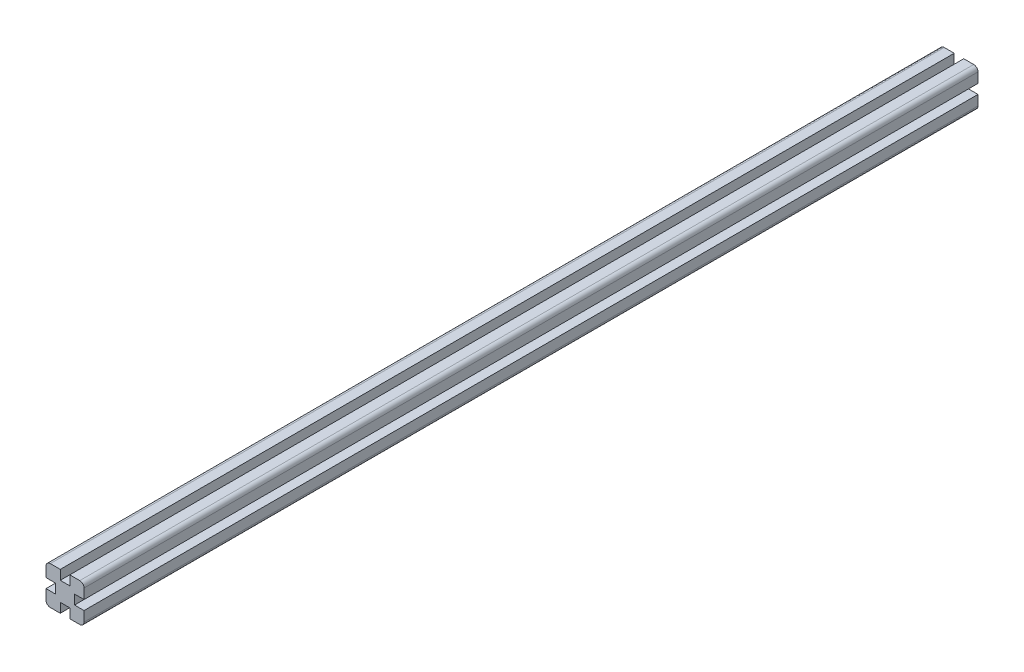
ISO-10303-21;
HEADER;
FILE_DESCRIPTION(('STEP AP214'),'2;1');
FILE_NAME('part.step','',(''),(''),'','','');
FILE_SCHEMA(('AUTOMOTIVE_DESIGN { 1 0 10303 214 1 1 1 1 }'));
ENDSEC;
DATA;
#1=APPLICATION_CONTEXT('core data for automotive mechanical design processes');
#2=APPLICATION_PROTOCOL_DEFINITION('international standard','automotive_design',2000,#1);
#3=PRODUCT_CONTEXT('',#1,'mechanical');
#4=PRODUCT('Part','Part','',(#3));
#5=PRODUCT_RELATED_PRODUCT_CATEGORY('part','',(#4));
#6=PRODUCT_DEFINITION_FORMATION('','',#4);
#7=PRODUCT_DEFINITION_CONTEXT('part definition',#1,'design');
#8=PRODUCT_DEFINITION('design','',#6,#7);
#9=PRODUCT_DEFINITION_SHAPE('','',#8);
#10=(LENGTH_UNIT() NAMED_UNIT(*) SI_UNIT(.MILLI.,.METRE.));
#11=(NAMED_UNIT(*) PLANE_ANGLE_UNIT() SI_UNIT($,.RADIAN.));
#12=(NAMED_UNIT(*) SI_UNIT($,.STERADIAN.) SOLID_ANGLE_UNIT());
#13=UNCERTAINTY_MEASURE_WITH_UNIT(LENGTH_MEASURE(1.E-05),#10,'distance_accuracy_value','');
#14=(GEOMETRIC_REPRESENTATION_CONTEXT(3) GLOBAL_UNCERTAINTY_ASSIGNED_CONTEXT((#13)) GLOBAL_UNIT_ASSIGNED_CONTEXT((#10,
#11,#12)) REPRESENTATION_CONTEXT('',''));
#15=CARTESIAN_POINT('',(0.,0.,0.));
#16=DIRECTION('',(0.,0.,1.));
#17=DIRECTION('',(1.,0.,0.));
#18=AXIS2_PLACEMENT_3D('',#15,#16,#17);
#19=CARTESIAN_POINT('',(-5.,-20.,940.));
#20=DIRECTION('',(-1.,0.,0.));
#21=DIRECTION('',(0.,-1.,0.));
#22=AXIS2_PLACEMENT_3D('',#19,#20,#21);
#23=PLANE('',#22);
#24=DIRECTION('',(0.,1.,0.));
#25=VECTOR('',#24,1.);
#26=CARTESIAN_POINT('',(-5.,-20.,0.));
#27=LINE('',#26,#25);
#28=CARTESIAN_POINT('',(-5.,-20.,0.));
#29=VERTEX_POINT('',#28);
#30=CARTESIAN_POINT('',(-5.,-10.,0.));
#31=VERTEX_POINT('',#30);
#32=EDGE_CURVE('E225',#29,#31,#27,.T.);
#33=ORIENTED_EDGE('',*,*,#32,.T.);
#34=DIRECTION('',(0.,0.,-1.));
#35=VECTOR('',#34,1.);
#36=CARTESIAN_POINT('',(-5.,-10.,940.));
#37=LINE('',#36,#35);
#38=CARTESIAN_POINT('',(-5.,-10.,940.));
#39=VERTEX_POINT('',#38);
#40=EDGE_CURVE('E11',#39,#31,#37,.T.);
#41=ORIENTED_EDGE('',*,*,#40,.F.);
#42=DIRECTION('',(0.,1.,0.));
#43=VECTOR('',#42,1.);
#44=CARTESIAN_POINT('',(-5.,-20.,940.));
#45=LINE('',#44,#43);
#46=CARTESIAN_POINT('',(-5.,-20.,940.));
#47=VERTEX_POINT('',#46);
#48=EDGE_CURVE('E272',#47,#39,#45,.T.);
#49=ORIENTED_EDGE('',*,*,#48,.F.);
#50=DIRECTION('',(0.,0.,-1.));
#51=VECTOR('',#50,1.);
#52=CARTESIAN_POINT('',(-5.,-20.,940.));
#53=LINE('',#52,#51);
#54=EDGE_CURVE('E221',#47,#29,#53,.T.);
#55=ORIENTED_EDGE('',*,*,#54,.T.);
#56=EDGE_LOOP('',(#33,#41,#49,#55));
#57=FACE_BOUND('',#56,.T.);
#58=ADVANCED_FACE('F33',(#57),#23,.F.);
#59=CARTESIAN_POINT('',(-5.,-10.,940.));
#60=DIRECTION('',(0.,1.,0.));
#61=DIRECTION('',(-1.,0.,0.));
#62=AXIS2_PLACEMENT_3D('',#59,#60,#61);
#63=PLANE('',#62);
#64=DIRECTION('',(1.,0.,0.));
#65=VECTOR('',#64,1.);
#66=CARTESIAN_POINT('',(-5.,-10.,0.));
#67=LINE('',#66,#65);
#68=CARTESIAN_POINT('',(5.,-10.,0.));
#69=VERTEX_POINT('',#68);
#70=EDGE_CURVE('E228',#31,#69,#67,.T.);
#71=ORIENTED_EDGE('',*,*,#70,.T.);
#72=DIRECTION('',(0.,0.,-1.));
#73=VECTOR('',#72,1.);
#74=CARTESIAN_POINT('',(5.,-10.,940.));
#75=LINE('',#74,#73);
#76=CARTESIAN_POINT('',(5.,-10.,940.));
#77=VERTEX_POINT('',#76);
#78=EDGE_CURVE('E41',#77,#69,#75,.T.);
#79=ORIENTED_EDGE('',*,*,#78,.F.);
#80=DIRECTION('',(1.,0.,0.));
#81=VECTOR('',#80,1.);
#82=CARTESIAN_POINT('',(-5.,-10.,940.));
#83=LINE('',#82,#81);
#84=EDGE_CURVE('E140',#39,#77,#83,.T.);
#85=ORIENTED_EDGE('',*,*,#84,.F.);
#86=ORIENTED_EDGE('',*,*,#40,.T.);
#87=EDGE_LOOP('',(#71,#79,#85,#86));
#88=FACE_BOUND('',#87,.T.);
#89=ADVANCED_FACE('F410',(#88),#63,.F.);
#90=CARTESIAN_POINT('',(5.,-20.,940.));
#91=DIRECTION('',(1.,0.,0.));
#92=DIRECTION('',(0.,0.,-1.));
#93=AXIS2_PLACEMENT_3D('',#90,#91,#92);
#94=PLANE('',#93);
#95=DIRECTION('',(0.,-1.,0.));
#96=VECTOR('',#95,1.);
#97=CARTESIAN_POINT('',(5.,-20.,0.));
#98=LINE('',#97,#96);
#99=CARTESIAN_POINT('',(5.,-20.,0.));
#100=VERTEX_POINT('',#99);
#101=EDGE_CURVE('E230',#69,#100,#98,.T.);
#102=ORIENTED_EDGE('',*,*,#101,.T.);
#103=DIRECTION('',(0.,0.,-1.));
#104=VECTOR('',#103,1.);
#105=CARTESIAN_POINT('',(5.,-20.,940.));
#106=LINE('',#105,#104);
#107=CARTESIAN_POINT('',(5.,-20.,940.));
#108=VERTEX_POINT('',#107);
#109=EDGE_CURVE('E327',#108,#100,#106,.T.);
#110=ORIENTED_EDGE('',*,*,#109,.F.);
#111=DIRECTION('',(0.,-1.,0.));
#112=VECTOR('',#111,1.);
#113=CARTESIAN_POINT('',(5.,-20.,940.));
#114=LINE('',#113,#112);
#115=EDGE_CURVE('E335',#77,#108,#114,.T.);
#116=ORIENTED_EDGE('',*,*,#115,.F.);
#117=ORIENTED_EDGE('',*,*,#78,.T.);
#118=EDGE_LOOP('',(#102,#110,#116,#117));
#119=FACE_BOUND('',#118,.T.);
#120=ADVANCED_FACE('F333',(#119),#94,.F.);
#121=CARTESIAN_POINT('',(5.,-20.,940.));
#122=DIRECTION('',(0.,1.,0.));
#123=DIRECTION('',(0.,0.,1.));
#124=AXIS2_PLACEMENT_3D('',#121,#122,#123);
#125=PLANE('',#124);
#126=DIRECTION('',(1.,0.,0.));
#127=VECTOR('',#126,1.);
#128=CARTESIAN_POINT('',(5.,-20.,0.));
#129=LINE('',#128,#127);
#130=CARTESIAN_POINT('',(15.5,-20.,0.));
#131=VERTEX_POINT('',#130);
#132=EDGE_CURVE('E232',#100,#131,#129,.T.);
#133=ORIENTED_EDGE('',*,*,#132,.T.);
#134=DIRECTION('',(0.,0.,-1.));
#135=VECTOR('',#134,1.);
#136=CARTESIAN_POINT('',(15.5,-20.,940.));
#137=LINE('',#136,#135);
#138=CARTESIAN_POINT('',(15.5,-20.,940.));
#139=VERTEX_POINT('',#138);
#140=EDGE_CURVE('E324',#139,#131,#137,.T.);
#141=ORIENTED_EDGE('',*,*,#140,.F.);
#142=DIRECTION('',(1.,0.,0.));
#143=VECTOR('',#142,1.);
#144=CARTESIAN_POINT('',(5.,-20.,940.));
#145=LINE('',#144,#143);
#146=EDGE_CURVE('E353',#108,#139,#145,.T.);
#147=ORIENTED_EDGE('',*,*,#146,.F.);
#148=ORIENTED_EDGE('',*,*,#109,.T.);
#149=EDGE_LOOP('',(#133,#141,#147,#148));
#150=FACE_BOUND('',#149,.T.);
#151=ADVANCED_FACE('F344',(#150),#125,.F.);
#152=CARTESIAN_POINT('',(15.5,-15.5,940.));
#153=DIRECTION('',(0.,0.,-1.));
#154=DIRECTION('',(-1.,0.,0.));
#155=AXIS2_PLACEMENT_3D('',#152,#153,#154);
#156=CYLINDRICAL_SURFACE('',#155,4.5);
#157=CARTESIAN_POINT('',(15.5,-15.5,0.));
#158=DIRECTION('',(0.,0.,1.));
#159=DIRECTION('',(1.,0.,0.));
#160=AXIS2_PLACEMENT_3D('',#157,#158,#159);
#161=CIRCLE('',#160,4.5);
#162=CARTESIAN_POINT('',(20.,-15.5,0.));
#163=VERTEX_POINT('',#162);
#164=EDGE_CURVE('E234',#131,#163,#161,.T.);
#165=ORIENTED_EDGE('',*,*,#164,.T.);
#166=DIRECTION('',(0.,0.,-1.));
#167=VECTOR('',#166,1.);
#168=CARTESIAN_POINT('',(20.,-15.5,940.));
#169=LINE('',#168,#167);
#170=CARTESIAN_POINT('',(20.,-15.5,940.));
#171=VERTEX_POINT('',#170);
#172=EDGE_CURVE('E321',#171,#163,#169,.T.);
#173=ORIENTED_EDGE('',*,*,#172,.F.);
#174=CARTESIAN_POINT('',(15.5,-15.5,940.));
#175=DIRECTION('',(0.,0.,1.));
#176=DIRECTION('',(1.,0.,0.));
#177=AXIS2_PLACEMENT_3D('',#174,#175,#176);
#178=CIRCLE('',#177,4.5);
#179=EDGE_CURVE('E350',#139,#171,#178,.T.);
#180=ORIENTED_EDGE('',*,*,#179,.F.);
#181=ORIENTED_EDGE('',*,*,#140,.T.);
#182=EDGE_LOOP('',(#165,#173,#180,#181));
#183=FACE_BOUND('',#182,.T.);
#184=ADVANCED_FACE('F348',(#183),#156,.T.);
#185=CARTESIAN_POINT('',(20.,-15.5,940.));
#186=DIRECTION('',(-1.,0.,0.));
#187=DIRECTION('',(0.,0.,1.));
#188=AXIS2_PLACEMENT_3D('',#185,#186,#187);
#189=PLANE('',#188);
#190=DIRECTION('',(0.,1.,0.));
#191=VECTOR('',#190,1.);
#192=CARTESIAN_POINT('',(20.,-15.5,0.));
#193=LINE('',#192,#191);
#194=CARTESIAN_POINT('',(20.,-4.99999999999999,0.));
#195=VERTEX_POINT('',#194);
#196=EDGE_CURVE('E236',#163,#195,#193,.T.);
#197=ORIENTED_EDGE('',*,*,#196,.T.);
#198=DIRECTION('',(0.,0.,-1.));
#199=VECTOR('',#198,1.);
#200=CARTESIAN_POINT('',(20.,-4.99999999999999,940.));
#201=LINE('',#200,#199);
#202=CARTESIAN_POINT('',(20.,-4.99999999999999,940.));
#203=VERTEX_POINT('',#202);
#204=EDGE_CURVE('E318',#203,#195,#201,.T.);
#205=ORIENTED_EDGE('',*,*,#204,.F.);
#206=DIRECTION('',(0.,1.,0.));
#207=VECTOR('',#206,1.);
#208=CARTESIAN_POINT('',(20.,-15.5,940.));
#209=LINE('',#208,#207);
#210=EDGE_CURVE('E352',#171,#203,#209,.T.);
#211=ORIENTED_EDGE('',*,*,#210,.F.);
#212=ORIENTED_EDGE('',*,*,#172,.T.);
#213=EDGE_LOOP('',(#197,#205,#211,#212));
#214=FACE_BOUND('',#213,.T.);
#215=ADVANCED_FACE('F423',(#214),#189,.F.);
#216=CARTESIAN_POINT('',(20.,-4.99999999999999,940.));
#217=DIRECTION('',(0.,-1.,0.));
#218=DIRECTION('',(1.,0.,0.));
#219=AXIS2_PLACEMENT_3D('',#216,#217,#218);
#220=PLANE('',#219);
#221=DIRECTION('',(-1.,0.,0.));
#222=VECTOR('',#221,1.);
#223=CARTESIAN_POINT('',(20.,-4.99999999999999,0.));
#224=LINE('',#223,#222);
#225=CARTESIAN_POINT('',(10.,-5.,0.));
#226=VERTEX_POINT('',#225);
#227=EDGE_CURVE('E238',#195,#226,#224,.T.);
#228=ORIENTED_EDGE('',*,*,#227,.T.);
#229=DIRECTION('',(0.,0.,-1.));
#230=VECTOR('',#229,1.);
#231=CARTESIAN_POINT('',(10.,-5.,940.));
#232=LINE('',#231,#230);
#233=CARTESIAN_POINT('',(10.,-5.,940.));
#234=VERTEX_POINT('',#233);
#235=EDGE_CURVE('E315',#234,#226,#232,.T.);
#236=ORIENTED_EDGE('',*,*,#235,.F.);
#237=DIRECTION('',(-1.,0.,0.));
#238=VECTOR('',#237,1.);
#239=CARTESIAN_POINT('',(20.,-4.99999999999999,940.));
#240=LINE('',#239,#238);
#241=EDGE_CURVE('E355',#203,#234,#240,.T.);
#242=ORIENTED_EDGE('',*,*,#241,.F.);
#243=ORIENTED_EDGE('',*,*,#204,.T.);
#244=EDGE_LOOP('',(#228,#236,#242,#243));
#245=FACE_BOUND('',#244,.T.);
#246=ADVANCED_FACE('F426',(#245),#220,.F.);
#247=CARTESIAN_POINT('',(10.,-5.,940.));
#248=DIRECTION('',(-1.,0.,0.));
#249=DIRECTION('',(0.,-1.,0.));
#250=AXIS2_PLACEMENT_3D('',#247,#248,#249);
#251=PLANE('',#250);
#252=DIRECTION('',(0.,1.,0.));
#253=VECTOR('',#252,1.);
#254=CARTESIAN_POINT('',(10.,-5.,0.));
#255=LINE('',#254,#253);
#256=CARTESIAN_POINT('',(10.,5.,0.));
#257=VERTEX_POINT('',#256);
#258=EDGE_CURVE('E240',#226,#257,#255,.T.);
#259=ORIENTED_EDGE('',*,*,#258,.T.);
#260=DIRECTION('',(0.,0.,-1.));
#261=VECTOR('',#260,1.);
#262=CARTESIAN_POINT('',(10.,5.,940.));
#263=LINE('',#262,#261);
#264=CARTESIAN_POINT('',(10.,5.,940.));
#265=VERTEX_POINT('',#264);
#266=EDGE_CURVE('E312',#265,#257,#263,.T.);
#267=ORIENTED_EDGE('',*,*,#266,.F.);
#268=DIRECTION('',(0.,1.,0.));
#269=VECTOR('',#268,1.);
#270=CARTESIAN_POINT('',(10.,-5.,940.));
#271=LINE('',#270,#269);
#272=EDGE_CURVE('E361',#234,#265,#271,.T.);
#273=ORIENTED_EDGE('',*,*,#272,.F.);
#274=ORIENTED_EDGE('',*,*,#235,.T.);
#275=EDGE_LOOP('',(#259,#267,#273,#274));
#276=FACE_BOUND('',#275,.T.);
#277=ADVANCED_FACE('F430',(#276),#251,.F.);
#278=CARTESIAN_POINT('',(20.,5.,940.));
#279=DIRECTION('',(0.,1.,0.));
#280=DIRECTION('',(-1.,0.,0.));
#281=AXIS2_PLACEMENT_3D('',#278,#279,#280);
#282=PLANE('',#281);
#283=DIRECTION('',(1.,0.,0.));
#284=VECTOR('',#283,1.);
#285=CARTESIAN_POINT('',(20.,5.,0.));
#286=LINE('',#285,#284);
#287=CARTESIAN_POINT('',(20.,5.,0.));
#288=VERTEX_POINT('',#287);
#289=EDGE_CURVE('E242',#257,#288,#286,.T.);
#290=ORIENTED_EDGE('',*,*,#289,.T.);
#291=DIRECTION('',(0.,0.,-1.));
#292=VECTOR('',#291,1.);
#293=CARTESIAN_POINT('',(20.,5.,940.));
#294=LINE('',#293,#292);
#295=CARTESIAN_POINT('',(20.,5.,940.));
#296=VERTEX_POINT('',#295);
#297=EDGE_CURVE('E309',#296,#288,#294,.T.);
#298=ORIENTED_EDGE('',*,*,#297,.F.);
#299=DIRECTION('',(1.,0.,0.));
#300=VECTOR('',#299,1.);
#301=CARTESIAN_POINT('',(20.,5.,940.));
#302=LINE('',#301,#300);
#303=EDGE_CURVE('E363',#265,#296,#302,.T.);
#304=ORIENTED_EDGE('',*,*,#303,.F.);
#305=ORIENTED_EDGE('',*,*,#266,.T.);
#306=EDGE_LOOP('',(#290,#298,#304,#305));
#307=FACE_BOUND('',#306,.T.);
#308=ADVANCED_FACE('F434',(#307),#282,.F.);
#309=CARTESIAN_POINT('',(20.,5.,940.));
#310=DIRECTION('',(-1.,0.,0.));
#311=DIRECTION('',(0.,0.,1.));
#312=AXIS2_PLACEMENT_3D('',#309,#310,#311);
#313=PLANE('',#312);
#314=DIRECTION('',(0.,1.,0.));
#315=VECTOR('',#314,1.);
#316=CARTESIAN_POINT('',(20.,5.,0.));
#317=LINE('',#316,#315);
#318=CARTESIAN_POINT('',(20.,15.5,0.));
#319=VERTEX_POINT('',#318);
#320=EDGE_CURVE('E244',#288,#319,#317,.T.);
#321=ORIENTED_EDGE('',*,*,#320,.T.);
#322=DIRECTION('',(0.,0.,-1.));
#323=VECTOR('',#322,1.);
#324=CARTESIAN_POINT('',(20.,15.5,940.));
#325=LINE('',#324,#323);
#326=CARTESIAN_POINT('',(20.,15.5,940.));
#327=VERTEX_POINT('',#326);
#328=EDGE_CURVE('E306',#327,#319,#325,.T.);
#329=ORIENTED_EDGE('',*,*,#328,.F.);
#330=DIRECTION('',(0.,1.,0.));
#331=VECTOR('',#330,1.);
#332=CARTESIAN_POINT('',(20.,5.,940.));
#333=LINE('',#332,#331);
#334=EDGE_CURVE('E365',#296,#327,#333,.T.);
#335=ORIENTED_EDGE('',*,*,#334,.F.);
#336=ORIENTED_EDGE('',*,*,#297,.T.);
#337=EDGE_LOOP('',(#321,#329,#335,#336));
#338=FACE_BOUND('',#337,.T.);
#339=ADVANCED_FACE('F438',(#338),#313,.F.);
#340=CARTESIAN_POINT('',(15.5,15.5,940.));
#341=DIRECTION('',(0.,0.,-1.));
#342=DIRECTION('',(-1.,0.,0.));
#343=AXIS2_PLACEMENT_3D('',#340,#341,#342);
#344=CYLINDRICAL_SURFACE('',#343,4.5);
#345=CARTESIAN_POINT('',(15.5,15.5,0.));
#346=DIRECTION('',(0.,0.,1.));
#347=DIRECTION('',(-1.,0.,0.));
#348=AXIS2_PLACEMENT_3D('',#345,#346,#347);
#349=CIRCLE('',#348,4.5);
#350=CARTESIAN_POINT('',(15.5,20.,0.));
#351=VERTEX_POINT('',#350);
#352=EDGE_CURVE('E246',#319,#351,#349,.T.);
#353=ORIENTED_EDGE('',*,*,#352,.T.);
#354=DIRECTION('',(0.,0.,-1.));
#355=VECTOR('',#354,1.);
#356=CARTESIAN_POINT('',(15.5,20.,940.));
#357=LINE('',#356,#355);
#358=CARTESIAN_POINT('',(15.5,20.,940.));
#359=VERTEX_POINT('',#358);
#360=EDGE_CURVE('E303',#359,#351,#357,.T.);
#361=ORIENTED_EDGE('',*,*,#360,.F.);
#362=CARTESIAN_POINT('',(15.5,15.5,940.));
#363=DIRECTION('',(0.,0.,1.));
#364=DIRECTION('',(-1.,0.,0.));
#365=AXIS2_PLACEMENT_3D('',#362,#363,#364);
#366=CIRCLE('',#365,4.5);
#367=EDGE_CURVE('E367',#327,#359,#366,.T.);
#368=ORIENTED_EDGE('',*,*,#367,.F.);
#369=ORIENTED_EDGE('',*,*,#328,.T.);
#370=EDGE_LOOP('',(#353,#361,#368,#369));
#371=FACE_BOUND('',#370,.T.);
#372=ADVANCED_FACE('F442',(#371),#344,.T.);
#373=CARTESIAN_POINT('',(4.99999999999999,20.,940.));
#374=DIRECTION('',(0.,-1.,0.));
#375=DIRECTION('',(0.,0.,-1.));
#376=AXIS2_PLACEMENT_3D('',#373,#374,#375);
#377=PLANE('',#376);
#378=DIRECTION('',(-1.,0.,0.));
#379=VECTOR('',#378,1.);
#380=CARTESIAN_POINT('',(4.99999999999999,20.,0.));
#381=LINE('',#380,#379);
#382=CARTESIAN_POINT('',(4.99999999999999,20.,0.));
#383=VERTEX_POINT('',#382);
#384=EDGE_CURVE('E248',#351,#383,#381,.T.);
#385=ORIENTED_EDGE('',*,*,#384,.T.);
#386=DIRECTION('',(0.,0.,-1.));
#387=VECTOR('',#386,1.);
#388=CARTESIAN_POINT('',(4.99999999999999,20.,940.));
#389=LINE('',#388,#387);
#390=CARTESIAN_POINT('',(4.99999999999999,20.,940.));
#391=VERTEX_POINT('',#390);
#392=EDGE_CURVE('E300',#391,#383,#389,.T.);
#393=ORIENTED_EDGE('',*,*,#392,.F.);
#394=DIRECTION('',(-1.,0.,0.));
#395=VECTOR('',#394,1.);
#396=CARTESIAN_POINT('',(4.99999999999999,20.,940.));
#397=LINE('',#396,#395);
#398=EDGE_CURVE('E369',#359,#391,#397,.T.);
#399=ORIENTED_EDGE('',*,*,#398,.F.);
#400=ORIENTED_EDGE('',*,*,#360,.T.);
#401=EDGE_LOOP('',(#385,#393,#399,#400));
#402=FACE_BOUND('',#401,.T.);
#403=ADVANCED_FACE('F446',(#402),#377,.F.);
#404=CARTESIAN_POINT('',(4.99999999999999,20.,940.));
#405=DIRECTION('',(1.,0.,0.));
#406=DIRECTION('',(0.,1.,0.));
#407=AXIS2_PLACEMENT_3D('',#404,#405,#406);
#408=PLANE('',#407);
#409=DIRECTION('',(0.,-1.,0.));
#410=VECTOR('',#409,1.);
#411=CARTESIAN_POINT('',(4.99999999999999,20.,0.));
#412=LINE('',#411,#410);
#413=CARTESIAN_POINT('',(5.,10.,0.));
#414=VERTEX_POINT('',#413);
#415=EDGE_CURVE('E250',#383,#414,#412,.T.);
#416=ORIENTED_EDGE('',*,*,#415,.T.);
#417=DIRECTION('',(0.,0.,-1.));
#418=VECTOR('',#417,1.);
#419=CARTESIAN_POINT('',(5.,10.,940.));
#420=LINE('',#419,#418);
#421=CARTESIAN_POINT('',(5.,10.,940.));
#422=VERTEX_POINT('',#421);
#423=EDGE_CURVE('E297',#422,#414,#420,.T.);
#424=ORIENTED_EDGE('',*,*,#423,.F.);
#425=DIRECTION('',(0.,-1.,0.));
#426=VECTOR('',#425,1.);
#427=CARTESIAN_POINT('',(4.99999999999999,20.,940.));
#428=LINE('',#427,#426);
#429=EDGE_CURVE('E371',#391,#422,#428,.T.);
#430=ORIENTED_EDGE('',*,*,#429,.F.);
#431=ORIENTED_EDGE('',*,*,#392,.T.);
#432=EDGE_LOOP('',(#416,#424,#430,#431));
#433=FACE_BOUND('',#432,.T.);
#434=ADVANCED_FACE('F450',(#433),#408,.F.);
#435=CARTESIAN_POINT('',(5.,10.,940.));
#436=DIRECTION('',(0.,-1.,0.));
#437=DIRECTION('',(1.,0.,0.));
#438=AXIS2_PLACEMENT_3D('',#435,#436,#437);
#439=PLANE('',#438);
#440=DIRECTION('',(-1.,0.,0.));
#441=VECTOR('',#440,1.);
#442=CARTESIAN_POINT('',(5.,10.,0.));
#443=LINE('',#442,#441);
#444=CARTESIAN_POINT('',(-5.,10.,0.));
#445=VERTEX_POINT('',#444);
#446=EDGE_CURVE('E252',#414,#445,#443,.T.);
#447=ORIENTED_EDGE('',*,*,#446,.T.);
#448=DIRECTION('',(0.,0.,-1.));
#449=VECTOR('',#448,1.);
#450=CARTESIAN_POINT('',(-5.,10.,940.));
#451=LINE('',#450,#449);
#452=CARTESIAN_POINT('',(-5.,10.,940.));
#453=VERTEX_POINT('',#452);
#454=EDGE_CURVE('E294',#453,#445,#451,.T.);
#455=ORIENTED_EDGE('',*,*,#454,.F.);
#456=DIRECTION('',(-1.,0.,0.));
#457=VECTOR('',#456,1.);
#458=CARTESIAN_POINT('',(5.,10.,940.));
#459=LINE('',#458,#457);
#460=EDGE_CURVE('E373',#422,#453,#459,.T.);
#461=ORIENTED_EDGE('',*,*,#460,.F.);
#462=ORIENTED_EDGE('',*,*,#423,.T.);
#463=EDGE_LOOP('',(#447,#455,#461,#462));
#464=FACE_BOUND('',#463,.T.);
#465=ADVANCED_FACE('F454',(#464),#439,.F.);
#466=CARTESIAN_POINT('',(-5.,20.,940.));
#467=DIRECTION('',(-1.,0.,0.));
#468=DIRECTION('',(0.,-1.,0.));
#469=AXIS2_PLACEMENT_3D('',#466,#467,#468);
#470=PLANE('',#469);
#471=DIRECTION('',(0.,1.,0.));
#472=VECTOR('',#471,1.);
#473=CARTESIAN_POINT('',(-5.,20.,0.));
#474=LINE('',#473,#472);
#475=CARTESIAN_POINT('',(-5.,20.,0.));
#476=VERTEX_POINT('',#475);
#477=EDGE_CURVE('E254',#445,#476,#474,.T.);
#478=ORIENTED_EDGE('',*,*,#477,.T.);
#479=DIRECTION('',(0.,0.,-1.));
#480=VECTOR('',#479,1.);
#481=CARTESIAN_POINT('',(-5.,20.,940.));
#482=LINE('',#481,#480);
#483=CARTESIAN_POINT('',(-5.,20.,940.));
#484=VERTEX_POINT('',#483);
#485=EDGE_CURVE('E291',#484,#476,#482,.T.);
#486=ORIENTED_EDGE('',*,*,#485,.F.);
#487=DIRECTION('',(0.,1.,0.));
#488=VECTOR('',#487,1.);
#489=CARTESIAN_POINT('',(-5.,20.,940.));
#490=LINE('',#489,#488);
#491=EDGE_CURVE('E375',#453,#484,#490,.T.);
#492=ORIENTED_EDGE('',*,*,#491,.F.);
#493=ORIENTED_EDGE('',*,*,#454,.T.);
#494=EDGE_LOOP('',(#478,#486,#492,#493));
#495=FACE_BOUND('',#494,.T.);
#496=ADVANCED_FACE('F458',(#495),#470,.F.);
#497=CARTESIAN_POINT('',(-15.5,20.,940.));
#498=DIRECTION('',(0.,-1.,0.));
#499=DIRECTION('',(0.,0.,-1.));
#500=AXIS2_PLACEMENT_3D('',#497,#498,#499);
#501=PLANE('',#500);
#502=DIRECTION('',(-1.,0.,0.));
#503=VECTOR('',#502,1.);
#504=CARTESIAN_POINT('',(-15.5,20.,0.));
#505=LINE('',#504,#503);
#506=CARTESIAN_POINT('',(-15.5,20.,0.));
#507=VERTEX_POINT('',#506);
#508=EDGE_CURVE('E257',#476,#507,#505,.T.);
#509=ORIENTED_EDGE('',*,*,#508,.T.);
#510=DIRECTION('',(0.,0.,-1.));
#511=VECTOR('',#510,1.);
#512=CARTESIAN_POINT('',(-15.5,20.,940.));
#513=LINE('',#512,#511);
#514=CARTESIAN_POINT('',(-15.5,20.,940.));
#515=VERTEX_POINT('',#514);
#516=EDGE_CURVE('E288',#515,#507,#513,.T.);
#517=ORIENTED_EDGE('',*,*,#516,.F.);
#518=DIRECTION('',(-1.,0.,0.));
#519=VECTOR('',#518,1.);
#520=CARTESIAN_POINT('',(-8.,20.,940.));
#521=LINE('',#520,#519);
#522=EDGE_CURVE('E377',#484,#515,#521,.T.);
#523=ORIENTED_EDGE('',*,*,#522,.F.);
#524=ORIENTED_EDGE('',*,*,#485,.T.);
#525=EDGE_LOOP('',(#509,#517,#523,#524));
#526=FACE_BOUND('',#525,.T.);
#527=ADVANCED_FACE('F462',(#526),#501,.F.);
#528=CARTESIAN_POINT('',(-15.5,15.5,940.));
#529=DIRECTION('',(0.,0.,-1.));
#530=DIRECTION('',(-1.,0.,0.));
#531=AXIS2_PLACEMENT_3D('',#528,#529,#530);
#532=CYLINDRICAL_SURFACE('',#531,4.5);
#533=CARTESIAN_POINT('',(-15.5,15.5,0.));
#534=DIRECTION('',(0.,0.,1.));
#535=DIRECTION('',(-1.,0.,0.));
#536=AXIS2_PLACEMENT_3D('',#533,#534,#535);
#537=CIRCLE('',#536,4.5);
#538=CARTESIAN_POINT('',(-20.,15.5,0.));
#539=VERTEX_POINT('',#538);
#540=EDGE_CURVE('E259',#507,#539,#537,.T.);
#541=ORIENTED_EDGE('',*,*,#540,.T.);
#542=DIRECTION('',(0.,0.,-1.));
#543=VECTOR('',#542,1.);
#544=CARTESIAN_POINT('',(-20.,15.5,940.));
#545=LINE('',#544,#543);
#546=CARTESIAN_POINT('',(-20.,15.5,940.));
#547=VERTEX_POINT('',#546);
#548=EDGE_CURVE('E285',#547,#539,#545,.T.);
#549=ORIENTED_EDGE('',*,*,#548,.F.);
#550=CARTESIAN_POINT('',(-15.5,15.5,940.));
#551=DIRECTION('',(0.,0.,1.));
#552=DIRECTION('',(-1.,0.,0.));
#553=AXIS2_PLACEMENT_3D('',#550,#551,#552);
#554=CIRCLE('',#553,4.5);
#555=EDGE_CURVE('E379',#515,#547,#554,.T.);
#556=ORIENTED_EDGE('',*,*,#555,.F.);
#557=ORIENTED_EDGE('',*,*,#516,.T.);
#558=EDGE_LOOP('',(#541,#549,#556,#557));
#559=FACE_BOUND('',#558,.T.);
#560=ADVANCED_FACE('F466',(#559),#532,.T.);
#561=CARTESIAN_POINT('',(-20.,4.99999999999999,940.));
#562=DIRECTION('',(1.,0.,0.));
#563=DIRECTION('',(0.,0.,-1.));
#564=AXIS2_PLACEMENT_3D('',#561,#562,#563);
#565=PLANE('',#564);
#566=DIRECTION('',(0.,-1.,0.));
#567=VECTOR('',#566,1.);
#568=CARTESIAN_POINT('',(-20.,4.99999999999999,0.));
#569=LINE('',#568,#567);
#570=CARTESIAN_POINT('',(-20.,4.99999999999999,0.));
#571=VERTEX_POINT('',#570);
#572=EDGE_CURVE('E261',#539,#571,#569,.T.);
#573=ORIENTED_EDGE('',*,*,#572,.T.);
#574=DIRECTION('',(0.,0.,-1.));
#575=VECTOR('',#574,1.);
#576=CARTESIAN_POINT('',(-20.,4.99999999999999,940.));
#577=LINE('',#576,#575);
#578=CARTESIAN_POINT('',(-20.,4.99999999999999,940.));
#579=VERTEX_POINT('',#578);
#580=EDGE_CURVE('E282',#579,#571,#577,.T.);
#581=ORIENTED_EDGE('',*,*,#580,.F.);
#582=DIRECTION('',(0.,-1.,0.));
#583=VECTOR('',#582,1.);
#584=CARTESIAN_POINT('',(-20.,4.99999999999999,940.));
#585=LINE('',#584,#583);
#586=EDGE_CURVE('E381',#547,#579,#585,.T.);
#587=ORIENTED_EDGE('',*,*,#586,.F.);
#588=ORIENTED_EDGE('',*,*,#548,.T.);
#589=EDGE_LOOP('',(#573,#581,#587,#588));
#590=FACE_BOUND('',#589,.T.);
#591=ADVANCED_FACE('F470',(#590),#565,.F.);
#592=CARTESIAN_POINT('',(-20.,4.99999999999999,940.));
#593=DIRECTION('',(0.,1.,0.));
#594=DIRECTION('',(-1.,0.,0.));
#595=AXIS2_PLACEMENT_3D('',#592,#593,#594);
#596=PLANE('',#595);
#597=DIRECTION('',(1.,0.,0.));
#598=VECTOR('',#597,1.);
#599=CARTESIAN_POINT('',(-20.,4.99999999999999,0.));
#600=LINE('',#599,#598);
#601=CARTESIAN_POINT('',(-10.,5.,0.));
#602=VERTEX_POINT('',#601);
#603=EDGE_CURVE('E263',#571,#602,#600,.T.);
#604=ORIENTED_EDGE('',*,*,#603,.T.);
#605=DIRECTION('',(0.,0.,-1.));
#606=VECTOR('',#605,1.);
#607=CARTESIAN_POINT('',(-10.,5.,940.));
#608=LINE('',#607,#606);
#609=CARTESIAN_POINT('',(-10.,5.,940.));
#610=VERTEX_POINT('',#609);
#611=EDGE_CURVE('E279',#610,#602,#608,.T.);
#612=ORIENTED_EDGE('',*,*,#611,.F.);
#613=DIRECTION('',(1.,0.,0.));
#614=VECTOR('',#613,1.);
#615=CARTESIAN_POINT('',(-20.,4.99999999999999,940.));
#616=LINE('',#615,#614);
#617=EDGE_CURVE('E383',#579,#610,#616,.T.);
#618=ORIENTED_EDGE('',*,*,#617,.F.);
#619=ORIENTED_EDGE('',*,*,#580,.T.);
#620=EDGE_LOOP('',(#604,#612,#618,#619));
#621=FACE_BOUND('',#620,.T.);
#622=ADVANCED_FACE('F474',(#621),#596,.F.);
#623=CARTESIAN_POINT('',(-10.,5.,940.));
#624=DIRECTION('',(1.,0.,0.));
#625=DIRECTION('',(0.,1.,0.));
#626=AXIS2_PLACEMENT_3D('',#623,#624,#625);
#627=PLANE('',#626);
#628=DIRECTION('',(0.,-1.,0.));
#629=VECTOR('',#628,1.);
#630=CARTESIAN_POINT('',(-10.,5.,0.));
#631=LINE('',#630,#629);
#632=CARTESIAN_POINT('',(-10.,-5.,0.));
#633=VERTEX_POINT('',#632);
#634=EDGE_CURVE('E265',#602,#633,#631,.T.);
#635=ORIENTED_EDGE('',*,*,#634,.T.);
#636=DIRECTION('',(0.,0.,-1.));
#637=VECTOR('',#636,1.);
#638=CARTESIAN_POINT('',(-10.,-5.,940.));
#639=LINE('',#638,#637);
#640=CARTESIAN_POINT('',(-10.,-5.,940.));
#641=VERTEX_POINT('',#640);
#642=EDGE_CURVE('E276',#641,#633,#639,.T.);
#643=ORIENTED_EDGE('',*,*,#642,.F.);
#644=DIRECTION('',(0.,-1.,0.));
#645=VECTOR('',#644,1.);
#646=CARTESIAN_POINT('',(-10.,5.,940.));
#647=LINE('',#646,#645);
#648=EDGE_CURVE('E385',#610,#641,#647,.T.);
#649=ORIENTED_EDGE('',*,*,#648,.F.);
#650=ORIENTED_EDGE('',*,*,#611,.T.);
#651=EDGE_LOOP('',(#635,#643,#649,#650));
#652=FACE_BOUND('',#651,.T.);
#653=ADVANCED_FACE('F391',(#652),#627,.F.);
#654=CARTESIAN_POINT('',(-20.,-5.,940.));
#655=DIRECTION('',(0.,-1.,0.));
#656=DIRECTION('',(0.,0.,-1.));
#657=AXIS2_PLACEMENT_3D('',#654,#655,#656);
#658=PLANE('',#657);
#659=DIRECTION('',(-1.,0.,0.));
#660=VECTOR('',#659,1.);
#661=CARTESIAN_POINT('',(-20.,-5.,0.));
#662=LINE('',#661,#660);
#663=CARTESIAN_POINT('',(-20.,-5.,0.));
#664=VERTEX_POINT('',#663);
#665=EDGE_CURVE('E267',#633,#664,#662,.T.);
#666=ORIENTED_EDGE('',*,*,#665,.T.);
#667=DIRECTION('',(0.,0.,-1.));
#668=VECTOR('',#667,1.);
#669=CARTESIAN_POINT('',(-20.,-5.,940.));
#670=LINE('',#669,#668);
#671=CARTESIAN_POINT('',(-20.,-5.,940.));
#672=VERTEX_POINT('',#671);
#673=EDGE_CURVE('E216',#672,#664,#670,.T.);
#674=ORIENTED_EDGE('',*,*,#673,.F.);
#675=DIRECTION('',(-1.,0.,0.));
#676=VECTOR('',#675,1.);
#677=CARTESIAN_POINT('',(-20.,-5.,940.));
#678=LINE('',#677,#676);
#679=EDGE_CURVE('E207',#641,#672,#678,.T.);
#680=ORIENTED_EDGE('',*,*,#679,.F.);
#681=ORIENTED_EDGE('',*,*,#642,.T.);
#682=EDGE_LOOP('',(#666,#674,#680,#681));
#683=FACE_BOUND('',#682,.T.);
#684=ADVANCED_FACE('F395',(#683),#658,.F.);
#685=CARTESIAN_POINT('',(-20.,-15.5,940.));
#686=DIRECTION('',(1.,0.,0.));
#687=DIRECTION('',(0.,0.,-1.));
#688=AXIS2_PLACEMENT_3D('',#685,#686,#687);
#689=PLANE('',#688);
#690=DIRECTION('',(0.,-1.,0.));
#691=VECTOR('',#690,1.);
#692=CARTESIAN_POINT('',(-20.,-15.5,0.));
#693=LINE('',#692,#691);
#694=CARTESIAN_POINT('',(-20.,-15.5,0.));
#695=VERTEX_POINT('',#694);
#696=EDGE_CURVE('E215',#664,#695,#693,.T.);
#697=ORIENTED_EDGE('',*,*,#696,.T.);
#698=DIRECTION('',(0.,0.,-1.));
#699=VECTOR('',#698,1.);
#700=CARTESIAN_POINT('',(-20.,-15.5,940.));
#701=LINE('',#700,#699);
#702=CARTESIAN_POINT('',(-20.,-15.5,940.));
#703=VERTEX_POINT('',#702);
#704=EDGE_CURVE('E212',#703,#695,#701,.T.);
#705=ORIENTED_EDGE('',*,*,#704,.F.);
#706=DIRECTION('',(0.,-1.,0.));
#707=VECTOR('',#706,1.);
#708=CARTESIAN_POINT('',(-20.,-15.5,940.));
#709=LINE('',#708,#707);
#710=EDGE_CURVE('E201',#672,#703,#709,.T.);
#711=ORIENTED_EDGE('',*,*,#710,.F.);
#712=ORIENTED_EDGE('',*,*,#673,.T.);
#713=EDGE_LOOP('',(#697,#705,#711,#712));
#714=FACE_BOUND('',#713,.T.);
#715=ADVANCED_FACE('F213',(#714),#689,.F.);
#716=CARTESIAN_POINT('',(-15.5,-15.5,940.));
#717=DIRECTION('',(0.,0.,-1.));
#718=DIRECTION('',(-1.,0.,0.));
#719=AXIS2_PLACEMENT_3D('',#716,#717,#718);
#720=CYLINDRICAL_SURFACE('',#719,4.5);
#721=CARTESIAN_POINT('',(-15.5,-15.5,0.));
#722=DIRECTION('',(0.,0.,1.));
#723=DIRECTION('',(-1.,0.,0.));
#724=AXIS2_PLACEMENT_3D('',#721,#722,#723);
#725=CIRCLE('',#724,4.5);
#726=CARTESIAN_POINT('',(-15.5,-20.,0.));
#727=VERTEX_POINT('',#726);
#728=EDGE_CURVE('E126',#695,#727,#725,.T.);
#729=ORIENTED_EDGE('',*,*,#728,.T.);
#730=DIRECTION('',(0.,0.,-1.));
#731=VECTOR('',#730,1.);
#732=CARTESIAN_POINT('',(-15.5,-20.,940.));
#733=LINE('',#732,#731);
#734=CARTESIAN_POINT('',(-15.5,-20.,940.));
#735=VERTEX_POINT('',#734);
#736=EDGE_CURVE('E217',#735,#727,#733,.T.);
#737=ORIENTED_EDGE('',*,*,#736,.F.);
#738=CARTESIAN_POINT('',(-15.5,-15.5,940.));
#739=DIRECTION('',(0.,0.,1.));
#740=DIRECTION('',(-1.,0.,0.));
#741=AXIS2_PLACEMENT_3D('',#738,#739,#740);
#742=CIRCLE('',#741,4.5);
#743=EDGE_CURVE('E205',#703,#735,#742,.T.);
#744=ORIENTED_EDGE('',*,*,#743,.F.);
#745=ORIENTED_EDGE('',*,*,#704,.T.);
#746=EDGE_LOOP('',(#729,#737,#744,#745));
#747=FACE_BOUND('',#746,.T.);
#748=ADVANCED_FACE('F219',(#747),#720,.T.);
#749=CARTESIAN_POINT('',(-15.5,-20.,940.));
#750=DIRECTION('',(0.,1.,0.));
#751=DIRECTION('',(0.,0.,1.));
#752=AXIS2_PLACEMENT_3D('',#749,#750,#751);
#753=PLANE('',#752);
#754=DIRECTION('',(1.,0.,0.));
#755=VECTOR('',#754,1.);
#756=CARTESIAN_POINT('',(-15.5,-20.,0.));
#757=LINE('',#756,#755);
#758=EDGE_CURVE('E132',#727,#29,#757,.T.);
#759=ORIENTED_EDGE('',*,*,#758,.T.);
#760=ORIENTED_EDGE('',*,*,#54,.F.);
#761=DIRECTION('',(1.,0.,0.));
#762=VECTOR('',#761,1.);
#763=CARTESIAN_POINT('',(-15.5,-20.,940.));
#764=LINE('',#763,#762);
#765=EDGE_CURVE('E49',#735,#47,#764,.T.);
#766=ORIENTED_EDGE('',*,*,#765,.F.);
#767=ORIENTED_EDGE('',*,*,#736,.T.);
#768=EDGE_LOOP('',(#759,#760,#766,#767));
#769=FACE_BOUND('',#768,.T.);
#770=ADVANCED_FACE('F399',(#769),#753,.F.);
#771=CARTESIAN_POINT('',(15.5,-15.5,940.));
#772=DIRECTION('',(0.,0.,1.));
#773=DIRECTION('',(1.,0.,0.));
#774=AXIS2_PLACEMENT_3D('',#771,#772,#773);
#775=PLANE('',#774);
#776=ORIENTED_EDGE('',*,*,#48,.T.);
#777=ORIENTED_EDGE('',*,*,#84,.T.);
#778=ORIENTED_EDGE('',*,*,#115,.T.);
#779=ORIENTED_EDGE('',*,*,#146,.T.);
#780=ORIENTED_EDGE('',*,*,#179,.T.);
#781=ORIENTED_EDGE('',*,*,#210,.T.);
#782=ORIENTED_EDGE('',*,*,#241,.T.);
#783=ORIENTED_EDGE('',*,*,#272,.T.);
#784=ORIENTED_EDGE('',*,*,#303,.T.);
#785=ORIENTED_EDGE('',*,*,#334,.T.);
#786=ORIENTED_EDGE('',*,*,#367,.T.);
#787=ORIENTED_EDGE('',*,*,#398,.T.);
#788=ORIENTED_EDGE('',*,*,#429,.T.);
#789=ORIENTED_EDGE('',*,*,#460,.T.);
#790=ORIENTED_EDGE('',*,*,#491,.T.);
#791=ORIENTED_EDGE('',*,*,#522,.T.);
#792=ORIENTED_EDGE('',*,*,#555,.T.);
#793=ORIENTED_EDGE('',*,*,#586,.T.);
#794=ORIENTED_EDGE('',*,*,#617,.T.);
#795=ORIENTED_EDGE('',*,*,#648,.T.);
#796=ORIENTED_EDGE('',*,*,#679,.T.);
#797=ORIENTED_EDGE('',*,*,#710,.T.);
#798=ORIENTED_EDGE('',*,*,#743,.T.);
#799=ORIENTED_EDGE('',*,*,#765,.T.);
#800=EDGE_LOOP('',(#776,#777,#778,#779,#780,#781,#782,#783,#784,#785,#786,#787,#788,#789,#790,
#791,#792,#793,#794,#795,#796,#797,#798,#799));
#801=FACE_BOUND('',#800,.T.);
#802=ADVANCED_FACE('F203',(#801),#775,.T.);
#803=CARTESIAN_POINT('',(15.5,-15.5,0.));
#804=DIRECTION('',(0.,0.,1.));
#805=DIRECTION('',(1.,0.,0.));
#806=AXIS2_PLACEMENT_3D('',#803,#804,#805);
#807=PLANE('',#806);
#808=ORIENTED_EDGE('',*,*,#32,.F.);
#809=ORIENTED_EDGE('',*,*,#758,.F.);
#810=ORIENTED_EDGE('',*,*,#728,.F.);
#811=ORIENTED_EDGE('',*,*,#696,.F.);
#812=ORIENTED_EDGE('',*,*,#665,.F.);
#813=ORIENTED_EDGE('',*,*,#634,.F.);
#814=ORIENTED_EDGE('',*,*,#603,.F.);
#815=ORIENTED_EDGE('',*,*,#572,.F.);
#816=ORIENTED_EDGE('',*,*,#540,.F.);
#817=ORIENTED_EDGE('',*,*,#508,.F.);
#818=ORIENTED_EDGE('',*,*,#477,.F.);
#819=ORIENTED_EDGE('',*,*,#446,.F.);
#820=ORIENTED_EDGE('',*,*,#415,.F.);
#821=ORIENTED_EDGE('',*,*,#384,.F.);
#822=ORIENTED_EDGE('',*,*,#352,.F.);
#823=ORIENTED_EDGE('',*,*,#320,.F.);
#824=ORIENTED_EDGE('',*,*,#289,.F.);
#825=ORIENTED_EDGE('',*,*,#258,.F.);
#826=ORIENTED_EDGE('',*,*,#227,.F.);
#827=ORIENTED_EDGE('',*,*,#196,.F.);
#828=ORIENTED_EDGE('',*,*,#164,.F.);
#829=ORIENTED_EDGE('',*,*,#132,.F.);
#830=ORIENTED_EDGE('',*,*,#101,.F.);
#831=ORIENTED_EDGE('',*,*,#70,.F.);
#832=EDGE_LOOP('',(#808,#809,#810,#811,#812,#813,#814,#815,#816,#817,#818,#819,#820,#821,#822,
#823,#824,#825,#826,#827,#828,#829,#830,#831));
#833=FACE_BOUND('',#832,.T.);
#834=ADVANCED_FACE('F339',(#833),#807,.F.);
#835=CLOSED_SHELL('',(#58,#89,#120,#151,#184,#215,#246,#277,#308,#339,#372,#403,#434,#465,#496,
#527,#560,#591,#622,#653,#684,#715,#748,#770,#802,#834));
#836=MANIFOLD_SOLID_BREP('B2',#835);
#837=ADVANCED_BREP_SHAPE_REPRESENTATION('',(#18,#836),#14);
#838=SHAPE_DEFINITION_REPRESENTATION(#9,#837);
ENDSEC;
END-ISO-10303-21;
